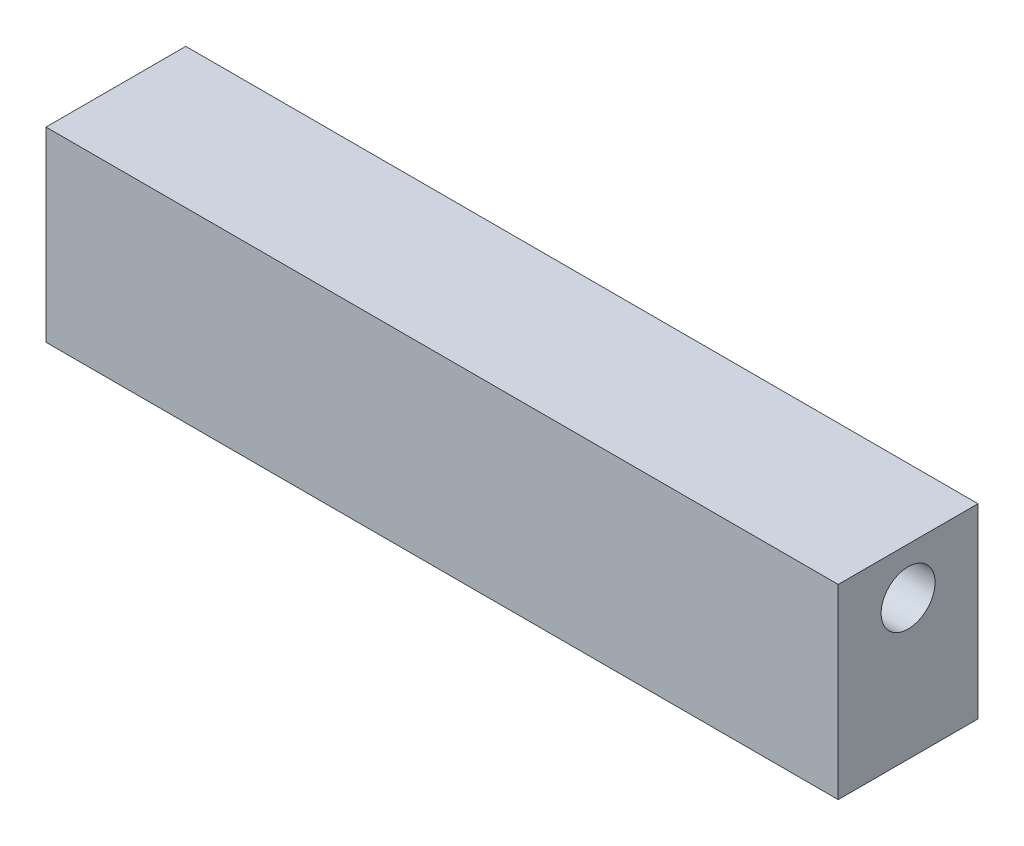
ISO-10303-21;
HEADER;
FILE_DESCRIPTION(('STEP AP214'),'2;1');
FILE_NAME('part.step','',(''),(''),'','','');
FILE_SCHEMA(('AUTOMOTIVE_DESIGN { 1 0 10303 214 1 1 1 1 }'));
ENDSEC;
DATA;
#1=APPLICATION_CONTEXT('core data for automotive mechanical design processes');
#2=APPLICATION_PROTOCOL_DEFINITION('international standard','automotive_design',2000,#1);
#3=PRODUCT_CONTEXT('',#1,'mechanical');
#4=PRODUCT('Part','Part','',(#3));
#5=PRODUCT_RELATED_PRODUCT_CATEGORY('part','',(#4));
#6=PRODUCT_DEFINITION_FORMATION('','',#4);
#7=PRODUCT_DEFINITION_CONTEXT('part definition',#1,'design');
#8=PRODUCT_DEFINITION('design','',#6,#7);
#9=PRODUCT_DEFINITION_SHAPE('','',#8);
#10=(LENGTH_UNIT() NAMED_UNIT(*) SI_UNIT(.MILLI.,.METRE.));
#11=(NAMED_UNIT(*) PLANE_ANGLE_UNIT() SI_UNIT($,.RADIAN.));
#12=(NAMED_UNIT(*) SI_UNIT($,.STERADIAN.) SOLID_ANGLE_UNIT());
#13=UNCERTAINTY_MEASURE_WITH_UNIT(LENGTH_MEASURE(1.E-05),#10,'distance_accuracy_value','');
#14=(GEOMETRIC_REPRESENTATION_CONTEXT(3) GLOBAL_UNCERTAINTY_ASSIGNED_CONTEXT((#13)) GLOBAL_UNIT_ASSIGNED_CONTEXT((#10,
#11,#12)) REPRESENTATION_CONTEXT('',''));
#15=CARTESIAN_POINT('',(0.,0.,0.));
#16=DIRECTION('',(0.,0.,1.));
#17=DIRECTION('',(1.,0.,0.));
#18=AXIS2_PLACEMENT_3D('',#15,#16,#17);
#19=CARTESIAN_POINT('',(0.,40.,0.));
#20=DIRECTION('',(1.,0.,0.));
#21=DIRECTION('',(0.,0.,-1.));
#22=AXIS2_PLACEMENT_3D('',#19,#20,#21);
#23=PLANE('',#22);
#24=CARTESIAN_POINT('',(0.,30.,-15.));
#25=DIRECTION('',(1.,0.,0.));
#26=DIRECTION('',(0.,0.,-1.));
#27=AXIS2_PLACEMENT_3D('',#24,#25,#26);
#28=CIRCLE('',#27,5.78906732142423);
#29=CARTESIAN_POINT('',(0.,30.,-20.7890673214242));
#30=VERTEX_POINT('',#29);
#31=EDGE_CURVE('E151',#30,#30,#28,.T.);
#32=ORIENTED_EDGE('',*,*,#31,.T.);
#33=EDGE_LOOP('',(#32));
#34=FACE_BOUND('',#33,.T.);
#35=DIRECTION('',(0.,0.,1.));
#36=VECTOR('',#35,1.);
#37=CARTESIAN_POINT('',(0.,0.,0.));
#38=LINE('',#37,#36);
#39=CARTESIAN_POINT('',(0.,0.,-30.));
#40=VERTEX_POINT('',#39);
#41=CARTESIAN_POINT('',(0.,0.,0.));
#42=VERTEX_POINT('',#41);
#43=EDGE_CURVE('E157',#40,#42,#38,.T.);
#44=ORIENTED_EDGE('',*,*,#43,.T.);
#45=DIRECTION('',(0.,-1.,0.));
#46=VECTOR('',#45,1.);
#47=CARTESIAN_POINT('',(0.,40.,0.));
#48=LINE('',#47,#46);
#49=CARTESIAN_POINT('',(0.,40.,0.));
#50=VERTEX_POINT('',#49);
#51=EDGE_CURVE('E11',#50,#42,#48,.T.);
#52=ORIENTED_EDGE('',*,*,#51,.F.);
#53=DIRECTION('',(0.,0.,1.));
#54=VECTOR('',#53,1.);
#55=CARTESIAN_POINT('',(0.,40.,0.));
#56=LINE('',#55,#54);
#57=CARTESIAN_POINT('',(0.,40.,-30.));
#58=VERTEX_POINT('',#57);
#59=EDGE_CURVE('E161',#58,#50,#56,.T.);
#60=ORIENTED_EDGE('',*,*,#59,.F.);
#61=DIRECTION('',(0.,-1.,0.));
#62=VECTOR('',#61,1.);
#63=CARTESIAN_POINT('',(0.,40.,-30.));
#64=LINE('',#63,#62);
#65=EDGE_CURVE('E167',#58,#40,#64,.T.);
#66=ORIENTED_EDGE('',*,*,#65,.T.);
#67=EDGE_LOOP('',(#44,#52,#60,#66));
#68=FACE_BOUND('',#67,.T.);
#69=ADVANCED_FACE('F45',(#34,#68),#23,.F.);
#70=CARTESIAN_POINT('',(0.,40.,0.));
#71=DIRECTION('',(0.,0.,-1.));
#72=DIRECTION('',(-1.,0.,0.));
#73=AXIS2_PLACEMENT_3D('',#70,#71,#72);
#74=PLANE('',#73);
#75=DIRECTION('',(1.,0.,0.));
#76=VECTOR('',#75,1.);
#77=CARTESIAN_POINT('',(0.,0.,0.));
#78=LINE('',#77,#76);
#79=CARTESIAN_POINT('',(170.,0.,0.));
#80=VERTEX_POINT('',#79);
#81=EDGE_CURVE('E170',#42,#80,#78,.T.);
#82=ORIENTED_EDGE('',*,*,#81,.T.);
#83=DIRECTION('',(0.,-1.,0.));
#84=VECTOR('',#83,1.);
#85=CARTESIAN_POINT('',(170.,40.,0.));
#86=LINE('',#85,#84);
#87=CARTESIAN_POINT('',(170.,40.,0.));
#88=VERTEX_POINT('',#87);
#89=EDGE_CURVE('E52',#88,#80,#86,.T.);
#90=ORIENTED_EDGE('',*,*,#89,.F.);
#91=DIRECTION('',(1.,0.,0.));
#92=VECTOR('',#91,1.);
#93=CARTESIAN_POINT('',(0.,40.,0.));
#94=LINE('',#93,#92);
#95=EDGE_CURVE('E96',#50,#88,#94,.T.);
#96=ORIENTED_EDGE('',*,*,#95,.F.);
#97=ORIENTED_EDGE('',*,*,#51,.T.);
#98=EDGE_LOOP('',(#82,#90,#96,#97));
#99=FACE_BOUND('',#98,.T.);
#100=ADVANCED_FACE('F197',(#99),#74,.F.);
#101=CARTESIAN_POINT('',(170.,40.,0.));
#102=DIRECTION('',(-1.,0.,0.));
#103=DIRECTION('',(0.,0.,1.));
#104=AXIS2_PLACEMENT_3D('',#101,#102,#103);
#105=PLANE('',#104);
#106=CARTESIAN_POINT('',(170.,30.,-15.));
#107=DIRECTION('',(1.,0.,0.));
#108=DIRECTION('',(0.,0.,-1.));
#109=AXIS2_PLACEMENT_3D('',#106,#107,#108);
#110=CIRCLE('',#109,5.78906732142423);
#111=CARTESIAN_POINT('',(170.,30.,-20.7890673214242));
#112=VERTEX_POINT('',#111);
#113=EDGE_CURVE('E144',#112,#112,#110,.T.);
#114=ORIENTED_EDGE('',*,*,#113,.F.);
#115=EDGE_LOOP('',(#114));
#116=FACE_BOUND('',#115,.T.);
#117=DIRECTION('',(0.,0.,-1.));
#118=VECTOR('',#117,1.);
#119=CARTESIAN_POINT('',(170.,0.,0.));
#120=LINE('',#119,#118);
#121=CARTESIAN_POINT('',(170.,0.,-30.));
#122=VERTEX_POINT('',#121);
#123=EDGE_CURVE('E172',#80,#122,#120,.T.);
#124=ORIENTED_EDGE('',*,*,#123,.T.);
#125=DIRECTION('',(0.,-1.,0.));
#126=VECTOR('',#125,1.);
#127=CARTESIAN_POINT('',(170.,40.,-30.));
#128=LINE('',#127,#126);
#129=CARTESIAN_POINT('',(170.,40.,-30.));
#130=VERTEX_POINT('',#129);
#131=EDGE_CURVE('E176',#130,#122,#128,.T.);
#132=ORIENTED_EDGE('',*,*,#131,.F.);
#133=DIRECTION('',(0.,0.,-1.));
#134=VECTOR('',#133,1.);
#135=CARTESIAN_POINT('',(170.,40.,0.));
#136=LINE('',#135,#134);
#137=EDGE_CURVE('E164',#88,#130,#136,.T.);
#138=ORIENTED_EDGE('',*,*,#137,.F.);
#139=ORIENTED_EDGE('',*,*,#89,.T.);
#140=EDGE_LOOP('',(#124,#132,#138,#139));
#141=FACE_BOUND('',#140,.T.);
#142=ADVANCED_FACE('F181',(#116,#141),#105,.F.);
#143=CARTESIAN_POINT('',(0.,40.,-30.));
#144=DIRECTION('',(0.,0.,1.));
#145=DIRECTION('',(1.,0.,0.));
#146=AXIS2_PLACEMENT_3D('',#143,#144,#145);
#147=PLANE('',#146);
#148=DIRECTION('',(-1.,0.,0.));
#149=VECTOR('',#148,1.);
#150=CARTESIAN_POINT('',(0.,0.,-30.));
#151=LINE('',#150,#149);
#152=EDGE_CURVE('E89',#122,#40,#151,.T.);
#153=ORIENTED_EDGE('',*,*,#152,.T.);
#154=ORIENTED_EDGE('',*,*,#65,.F.);
#155=DIRECTION('',(-1.,0.,0.));
#156=VECTOR('',#155,1.);
#157=CARTESIAN_POINT('',(0.,40.,-30.));
#158=LINE('',#157,#156);
#159=EDGE_CURVE('E68',#130,#58,#158,.T.);
#160=ORIENTED_EDGE('',*,*,#159,.F.);
#161=ORIENTED_EDGE('',*,*,#131,.T.);
#162=EDGE_LOOP('',(#153,#154,#160,#161));
#163=FACE_BOUND('',#162,.T.);
#164=ADVANCED_FACE('F189',(#163),#147,.F.);
#165=CARTESIAN_POINT('',(0.,40.,0.));
#166=DIRECTION('',(0.,-1.,0.));
#167=DIRECTION('',(0.,0.,-1.));
#168=AXIS2_PLACEMENT_3D('',#165,#166,#167);
#169=PLANE('',#168);
#170=ORIENTED_EDGE('',*,*,#59,.T.);
#171=ORIENTED_EDGE('',*,*,#95,.T.);
#172=ORIENTED_EDGE('',*,*,#137,.T.);
#173=ORIENTED_EDGE('',*,*,#159,.T.);
#174=EDGE_LOOP('',(#170,#171,#172,#173));
#175=FACE_BOUND('',#174,.T.);
#176=ADVANCED_FACE('F191',(#175),#169,.F.);
#177=CARTESIAN_POINT('',(0.,0.,0.));
#178=DIRECTION('',(0.,-1.,0.));
#179=DIRECTION('',(0.,0.,-1.));
#180=AXIS2_PLACEMENT_3D('',#177,#178,#179);
#181=PLANE('',#180);
#182=DIRECTION('',(0.,0.,-1.));
#183=VECTOR('',#182,1.);
#184=CARTESIAN_POINT('',(10.,0.,-10.));
#185=LINE('',#184,#183);
#186=CARTESIAN_POINT('',(10.,0.,-10.));
#187=VERTEX_POINT('',#186);
#188=CARTESIAN_POINT('',(10.,0.,-20.));
#189=VERTEX_POINT('',#188);
#190=EDGE_CURVE('E59',#187,#189,#185,.T.);
#191=ORIENTED_EDGE('',*,*,#190,.F.);
#192=DIRECTION('',(-1.,0.,0.));
#193=VECTOR('',#192,1.);
#194=CARTESIAN_POINT('',(10.,0.,-10.));
#195=LINE('',#194,#193);
#196=CARTESIAN_POINT('',(160.,0.,-10.));
#197=VERTEX_POINT('',#196);
#198=EDGE_CURVE('E138',#197,#187,#195,.T.);
#199=ORIENTED_EDGE('',*,*,#198,.F.);
#200=DIRECTION('',(0.,0.,1.));
#201=VECTOR('',#200,1.);
#202=CARTESIAN_POINT('',(160.,0.,-10.));
#203=LINE('',#202,#201);
#204=CARTESIAN_POINT('',(160.,0.,-20.));
#205=VERTEX_POINT('',#204);
#206=EDGE_CURVE('E141',#205,#197,#203,.T.);
#207=ORIENTED_EDGE('',*,*,#206,.F.);
#208=DIRECTION('',(1.,0.,0.));
#209=VECTOR('',#208,1.);
#210=CARTESIAN_POINT('',(10.,0.,-20.));
#211=LINE('',#210,#209);
#212=EDGE_CURVE('E150',#189,#205,#211,.T.);
#213=ORIENTED_EDGE('',*,*,#212,.F.);
#214=EDGE_LOOP('',(#191,#199,#207,#213));
#215=FACE_BOUND('',#214,.T.);
#216=ORIENTED_EDGE('',*,*,#43,.F.);
#217=ORIENTED_EDGE('',*,*,#152,.F.);
#218=ORIENTED_EDGE('',*,*,#123,.F.);
#219=ORIENTED_EDGE('',*,*,#81,.F.);
#220=EDGE_LOOP('',(#216,#217,#218,#219));
#221=FACE_BOUND('',#220,.T.);
#222=ADVANCED_FACE('F185',(#215,#221),#181,.T.);
#223=CARTESIAN_POINT('',(10.,20.,-10.));
#224=DIRECTION('',(-1.,0.,0.));
#225=DIRECTION('',(0.,0.,1.));
#226=AXIS2_PLACEMENT_3D('',#223,#224,#225);
#227=PLANE('',#226);
#228=ORIENTED_EDGE('',*,*,#190,.T.);
#229=DIRECTION('',(0.,-1.,0.));
#230=VECTOR('',#229,1.);
#231=CARTESIAN_POINT('',(10.,20.,-20.));
#232=LINE('',#231,#230);
#233=CARTESIAN_POINT('',(10.,20.,-20.));
#234=VERTEX_POINT('',#233);
#235=EDGE_CURVE('E116',#234,#189,#232,.T.);
#236=ORIENTED_EDGE('',*,*,#235,.F.);
#237=DIRECTION('',(0.,0.,-1.));
#238=VECTOR('',#237,1.);
#239=CARTESIAN_POINT('',(10.,20.,-10.));
#240=LINE('',#239,#238);
#241=CARTESIAN_POINT('',(10.,20.,-10.));
#242=VERTEX_POINT('',#241);
#243=EDGE_CURVE('E120',#242,#234,#240,.T.);
#244=ORIENTED_EDGE('',*,*,#243,.F.);
#245=DIRECTION('',(0.,-1.,0.));
#246=VECTOR('',#245,1.);
#247=CARTESIAN_POINT('',(10.,20.,-10.));
#248=LINE('',#247,#246);
#249=EDGE_CURVE('E155',#242,#187,#248,.T.);
#250=ORIENTED_EDGE('',*,*,#249,.T.);
#251=EDGE_LOOP('',(#228,#236,#244,#250));
#252=FACE_BOUND('',#251,.T.);
#253=ADVANCED_FACE('F118',(#252),#227,.F.);
#254=CARTESIAN_POINT('',(10.,20.,-10.));
#255=DIRECTION('',(0.,0.,1.));
#256=DIRECTION('',(1.,0.,0.));
#257=AXIS2_PLACEMENT_3D('',#254,#255,#256);
#258=PLANE('',#257);
#259=ORIENTED_EDGE('',*,*,#198,.T.);
#260=ORIENTED_EDGE('',*,*,#249,.F.);
#261=DIRECTION('',(-1.,0.,0.));
#262=VECTOR('',#261,1.);
#263=CARTESIAN_POINT('',(10.,20.,-10.));
#264=LINE('',#263,#262);
#265=CARTESIAN_POINT('',(160.,20.,-10.));
#266=VERTEX_POINT('',#265);
#267=EDGE_CURVE('E126',#266,#242,#264,.T.);
#268=ORIENTED_EDGE('',*,*,#267,.F.);
#269=DIRECTION('',(0.,-1.,0.));
#270=VECTOR('',#269,1.);
#271=CARTESIAN_POINT('',(160.,20.,-10.));
#272=LINE('',#271,#270);
#273=EDGE_CURVE('E158',#266,#197,#272,.T.);
#274=ORIENTED_EDGE('',*,*,#273,.T.);
#275=EDGE_LOOP('',(#259,#260,#268,#274));
#276=FACE_BOUND('',#275,.T.);
#277=ADVANCED_FACE('F220',(#276),#258,.F.);
#278=CARTESIAN_POINT('',(160.,20.,-10.));
#279=DIRECTION('',(1.,0.,0.));
#280=DIRECTION('',(0.,0.,-1.));
#281=AXIS2_PLACEMENT_3D('',#278,#279,#280);
#282=PLANE('',#281);
#283=ORIENTED_EDGE('',*,*,#206,.T.);
#284=ORIENTED_EDGE('',*,*,#273,.F.);
#285=DIRECTION('',(0.,0.,1.));
#286=VECTOR('',#285,1.);
#287=CARTESIAN_POINT('',(160.,20.,-10.));
#288=LINE('',#287,#286);
#289=CARTESIAN_POINT('',(160.,20.,-20.));
#290=VERTEX_POINT('',#289);
#291=EDGE_CURVE('E134',#290,#266,#288,.T.);
#292=ORIENTED_EDGE('',*,*,#291,.F.);
#293=DIRECTION('',(0.,-1.,0.));
#294=VECTOR('',#293,1.);
#295=CARTESIAN_POINT('',(160.,20.,-20.));
#296=LINE('',#295,#294);
#297=EDGE_CURVE('E125',#290,#205,#296,.T.);
#298=ORIENTED_EDGE('',*,*,#297,.T.);
#299=EDGE_LOOP('',(#283,#284,#292,#298));
#300=FACE_BOUND('',#299,.T.);
#301=ADVANCED_FACE('F223',(#300),#282,.F.);
#302=CARTESIAN_POINT('',(10.,20.,-20.));
#303=DIRECTION('',(0.,0.,-1.));
#304=DIRECTION('',(-1.,0.,0.));
#305=AXIS2_PLACEMENT_3D('',#302,#303,#304);
#306=PLANE('',#305);
#307=ORIENTED_EDGE('',*,*,#212,.T.);
#308=ORIENTED_EDGE('',*,*,#297,.F.);
#309=DIRECTION('',(1.,0.,0.));
#310=VECTOR('',#309,1.);
#311=CARTESIAN_POINT('',(10.,20.,-20.));
#312=LINE('',#311,#310);
#313=EDGE_CURVE('E129',#234,#290,#312,.T.);
#314=ORIENTED_EDGE('',*,*,#313,.F.);
#315=ORIENTED_EDGE('',*,*,#235,.T.);
#316=EDGE_LOOP('',(#307,#308,#314,#315));
#317=FACE_BOUND('',#316,.T.);
#318=ADVANCED_FACE('F130',(#317),#306,.F.);
#319=CARTESIAN_POINT('',(0.,20.,0.));
#320=DIRECTION('',(0.,-1.,0.));
#321=DIRECTION('',(0.,0.,-1.));
#322=AXIS2_PLACEMENT_3D('',#319,#320,#321);
#323=PLANE('',#322);
#324=ORIENTED_EDGE('',*,*,#243,.T.);
#325=ORIENTED_EDGE('',*,*,#313,.T.);
#326=ORIENTED_EDGE('',*,*,#291,.T.);
#327=ORIENTED_EDGE('',*,*,#267,.T.);
#328=EDGE_LOOP('',(#324,#325,#326,#327));
#329=FACE_BOUND('',#328,.T.);
#330=ADVANCED_FACE('F136',(#329),#323,.T.);
#331=CARTESIAN_POINT('',(0.,30.,-15.));
#332=DIRECTION('',(1.,0.,0.));
#333=DIRECTION('',(0.,0.,-1.));
#334=AXIS2_PLACEMENT_3D('',#331,#332,#333);
#335=CYLINDRICAL_SURFACE('',#334,5.78906732142423);
#336=ORIENTED_EDGE('',*,*,#31,.F.);
#337=EDGE_LOOP('',(#336));
#338=FACE_BOUND('',#337,.T.);
#339=ORIENTED_EDGE('',*,*,#113,.T.);
#340=EDGE_LOOP('',(#339));
#341=FACE_BOUND('',#340,.T.);
#342=ADVANCED_FACE('F211',(#338,#341),#335,.F.);
#343=CLOSED_SHELL('',(#69,#100,#142,#164,#176,#222,#253,#277,#301,#318,#330,#342));
#344=MANIFOLD_SOLID_BREP('B2',#343);
#345=ADVANCED_BREP_SHAPE_REPRESENTATION('',(#18,#344),#14);
#346=SHAPE_DEFINITION_REPRESENTATION(#9,#345);
ENDSEC;
END-ISO-10303-21;
